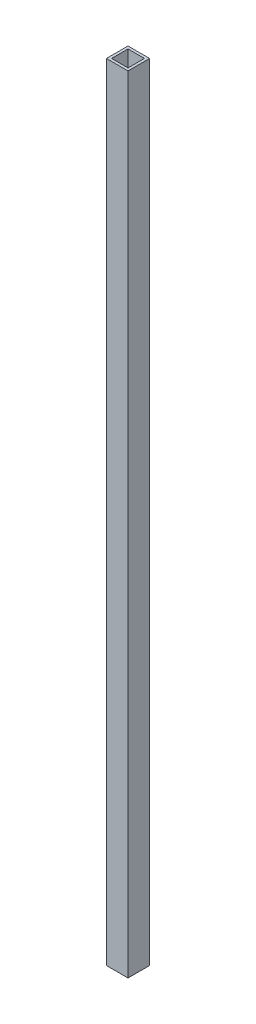
ISO-10303-21;
HEADER;
FILE_DESCRIPTION(('STEP AP214'),'2;1');
FILE_NAME('part.step','',(''),(''),'','','');
FILE_SCHEMA(('AUTOMOTIVE_DESIGN { 1 0 10303 214 1 1 1 1 }'));
ENDSEC;
DATA;
#1=APPLICATION_CONTEXT('core data for automotive mechanical design processes');
#2=APPLICATION_PROTOCOL_DEFINITION('international standard','automotive_design',2000,#1);
#3=PRODUCT_CONTEXT('',#1,'mechanical');
#4=PRODUCT('Part','Part','',(#3));
#5=PRODUCT_RELATED_PRODUCT_CATEGORY('part','',(#4));
#6=PRODUCT_DEFINITION_FORMATION('','',#4);
#7=PRODUCT_DEFINITION_CONTEXT('part definition',#1,'design');
#8=PRODUCT_DEFINITION('design','',#6,#7);
#9=PRODUCT_DEFINITION_SHAPE('','',#8);
#10=(LENGTH_UNIT() NAMED_UNIT(*) SI_UNIT(.MILLI.,.METRE.));
#11=(NAMED_UNIT(*) PLANE_ANGLE_UNIT() SI_UNIT($,.RADIAN.));
#12=(NAMED_UNIT(*) SI_UNIT($,.STERADIAN.) SOLID_ANGLE_UNIT());
#13=UNCERTAINTY_MEASURE_WITH_UNIT(LENGTH_MEASURE(1.E-05),#10,'distance_accuracy_value','');
#14=(GEOMETRIC_REPRESENTATION_CONTEXT(3) GLOBAL_UNCERTAINTY_ASSIGNED_CONTEXT((#13)) GLOBAL_UNIT_ASSIGNED_CONTEXT((#10,
#11,#12)) REPRESENTATION_CONTEXT('',''));
#15=CARTESIAN_POINT('',(0.,0.,0.));
#16=DIRECTION('',(0.,0.,1.));
#17=DIRECTION('',(1.,0.,0.));
#18=AXIS2_PLACEMENT_3D('',#15,#16,#17);
#19=CARTESIAN_POINT('',(0.,310.,0.));
#20=DIRECTION('',(0.,-1.,0.));
#21=DIRECTION('',(0.,0.,-1.));
#22=AXIS2_PLACEMENT_3D('',#19,#20,#21);
#23=PLANE('',#22);
#24=DIRECTION('',(0.,0.,1.));
#25=VECTOR('',#24,1.);
#26=CARTESIAN_POINT('',(15.8767045454545,310.,-21.8352272727272));
#27=LINE('',#26,#25);
#28=CARTESIAN_POINT('',(15.8767045454545,310.,-30.3352272727272));
#29=VERTEX_POINT('',#28);
#30=CARTESIAN_POINT('',(15.8767045454545,310.,-21.8352272727272));
#31=VERTEX_POINT('',#30);
#32=EDGE_CURVE('E153',#29,#31,#27,.T.);
#33=ORIENTED_EDGE('',*,*,#32,.T.);
#34=DIRECTION('',(1.,0.,0.));
#35=VECTOR('',#34,1.);
#36=CARTESIAN_POINT('',(15.8767045454545,310.,-21.8352272727272));
#37=LINE('',#36,#35);
#38=CARTESIAN_POINT('',(24.3767045454545,310.,-21.8352272727272));
#39=VERTEX_POINT('',#38);
#40=EDGE_CURVE('E157',#31,#39,#37,.T.);
#41=ORIENTED_EDGE('',*,*,#40,.T.);
#42=DIRECTION('',(0.,0.,-1.));
#43=VECTOR('',#42,1.);
#44=CARTESIAN_POINT('',(24.3767045454545,310.,-21.8352272727272));
#45=LINE('',#44,#43);
#46=CARTESIAN_POINT('',(24.3767045454545,310.,-30.3352272727272));
#47=VERTEX_POINT('',#46);
#48=EDGE_CURVE('E161',#39,#47,#45,.T.);
#49=ORIENTED_EDGE('',*,*,#48,.T.);
#50=DIRECTION('',(-1.,0.,0.));
#51=VECTOR('',#50,1.);
#52=CARTESIAN_POINT('',(15.8767045454545,310.,-30.3352272727272));
#53=LINE('',#52,#51);
#54=EDGE_CURVE('E164',#47,#29,#53,.T.);
#55=ORIENTED_EDGE('',*,*,#54,.T.);
#56=EDGE_LOOP('',(#33,#41,#49,#55));
#57=FACE_BOUND('',#56,.T.);
#58=DIRECTION('',(0.,0.,1.));
#59=VECTOR('',#58,1.);
#60=CARTESIAN_POINT('',(16.8767045454545,310.,-29.3352272727272));
#61=LINE('',#60,#59);
#62=CARTESIAN_POINT('',(16.8767045454545,310.,-29.3352272727272));
#63=VERTEX_POINT('',#62);
#64=CARTESIAN_POINT('',(16.8767045454545,310.,-22.8352272727272));
#65=VERTEX_POINT('',#64);
#66=EDGE_CURVE('E105',#63,#65,#61,.T.);
#67=ORIENTED_EDGE('',*,*,#66,.F.);
#68=DIRECTION('',(-1.,0.,0.));
#69=VECTOR('',#68,1.);
#70=CARTESIAN_POINT('',(16.8767045454545,310.,-29.3352272727272));
#71=LINE('',#70,#69);
#72=CARTESIAN_POINT('',(23.3767045454545,310.,-29.3352272727272));
#73=VERTEX_POINT('',#72);
#74=EDGE_CURVE('E131',#73,#63,#71,.T.);
#75=ORIENTED_EDGE('',*,*,#74,.F.);
#76=DIRECTION('',(0.,0.,-1.));
#77=VECTOR('',#76,1.);
#78=CARTESIAN_POINT('',(23.3767045454545,310.,-29.3352272727272));
#79=LINE('',#78,#77);
#80=CARTESIAN_POINT('',(23.3767045454545,310.,-22.8352272727272));
#81=VERTEX_POINT('',#80);
#82=EDGE_CURVE('E127',#81,#73,#79,.T.);
#83=ORIENTED_EDGE('',*,*,#82,.F.);
#84=DIRECTION('',(1.,0.,0.));
#85=VECTOR('',#84,1.);
#86=CARTESIAN_POINT('',(16.8767045454545,310.,-22.8352272727272));
#87=LINE('',#86,#85);
#88=EDGE_CURVE('E114',#65,#81,#87,.T.);
#89=ORIENTED_EDGE('',*,*,#88,.F.);
#90=EDGE_LOOP('',(#67,#75,#83,#89));
#91=FACE_BOUND('',#90,.T.);
#92=ADVANCED_FACE('F39',(#57,#91),#23,.F.);
#93=CARTESIAN_POINT('',(0.,0.,0.));
#94=DIRECTION('',(0.,-1.,0.));
#95=DIRECTION('',(0.,0.,-1.));
#96=AXIS2_PLACEMENT_3D('',#93,#94,#95);
#97=PLANE('',#96);
#98=DIRECTION('',(0.,0.,1.));
#99=VECTOR('',#98,1.);
#100=CARTESIAN_POINT('',(15.8767045454545,0.,-21.8352272727272));
#101=LINE('',#100,#99);
#102=CARTESIAN_POINT('',(15.8767045454545,0.,-30.3352272727272));
#103=VERTEX_POINT('',#102);
#104=CARTESIAN_POINT('',(15.8767045454545,0.,-21.8352272727272));
#105=VERTEX_POINT('',#104);
#106=EDGE_CURVE('E123',#103,#105,#101,.T.);
#107=ORIENTED_EDGE('',*,*,#106,.F.);
#108=DIRECTION('',(-1.,0.,0.));
#109=VECTOR('',#108,1.);
#110=CARTESIAN_POINT('',(15.8767045454545,0.,-30.3352272727272));
#111=LINE('',#110,#109);
#112=CARTESIAN_POINT('',(24.3767045454545,0.,-30.3352272727272));
#113=VERTEX_POINT('',#112);
#114=EDGE_CURVE('E158',#113,#103,#111,.T.);
#115=ORIENTED_EDGE('',*,*,#114,.F.);
#116=DIRECTION('',(0.,0.,-1.));
#117=VECTOR('',#116,1.);
#118=CARTESIAN_POINT('',(24.3767045454545,0.,-21.8352272727272));
#119=LINE('',#118,#117);
#120=CARTESIAN_POINT('',(24.3767045454545,0.,-21.8352272727272));
#121=VERTEX_POINT('',#120);
#122=EDGE_CURVE('E174',#121,#113,#119,.T.);
#123=ORIENTED_EDGE('',*,*,#122,.F.);
#124=DIRECTION('',(1.,0.,0.));
#125=VECTOR('',#124,1.);
#126=CARTESIAN_POINT('',(15.8767045454545,0.,-21.8352272727272));
#127=LINE('',#126,#125);
#128=EDGE_CURVE('E171',#105,#121,#127,.T.);
#129=ORIENTED_EDGE('',*,*,#128,.F.);
#130=EDGE_LOOP('',(#107,#115,#123,#129));
#131=FACE_BOUND('',#130,.T.);
#132=DIRECTION('',(-1.,0.,0.));
#133=VECTOR('',#132,1.);
#134=CARTESIAN_POINT('',(16.8767045454545,0.,-29.3352272727272));
#135=LINE('',#134,#133);
#136=CARTESIAN_POINT('',(23.3767045454545,0.,-29.3352272727272));
#137=VERTEX_POINT('',#136);
#138=CARTESIAN_POINT('',(16.8767045454545,0.,-29.3352272727272));
#139=VERTEX_POINT('',#138);
#140=EDGE_CURVE('E115',#137,#139,#135,.T.);
#141=ORIENTED_EDGE('',*,*,#140,.T.);
#142=DIRECTION('',(0.,0.,1.));
#143=VECTOR('',#142,1.);
#144=CARTESIAN_POINT('',(16.8767045454545,0.,-29.3352272727272));
#145=LINE('',#144,#143);
#146=CARTESIAN_POINT('',(16.8767045454545,0.,-22.8352272727272));
#147=VERTEX_POINT('',#146);
#148=EDGE_CURVE('E63',#139,#147,#145,.T.);
#149=ORIENTED_EDGE('',*,*,#148,.T.);
#150=DIRECTION('',(1.,0.,0.));
#151=VECTOR('',#150,1.);
#152=CARTESIAN_POINT('',(16.8767045454545,0.,-22.8352272727272));
#153=LINE('',#152,#151);
#154=CARTESIAN_POINT('',(23.3767045454545,0.,-22.8352272727272));
#155=VERTEX_POINT('',#154);
#156=EDGE_CURVE('E121',#147,#155,#153,.T.);
#157=ORIENTED_EDGE('',*,*,#156,.T.);
#158=DIRECTION('',(0.,0.,-1.));
#159=VECTOR('',#158,1.);
#160=CARTESIAN_POINT('',(23.3767045454545,0.,-29.3352272727272));
#161=LINE('',#160,#159);
#162=EDGE_CURVE('E140',#155,#137,#161,.T.);
#163=ORIENTED_EDGE('',*,*,#162,.T.);
#164=EDGE_LOOP('',(#141,#149,#157,#163));
#165=FACE_BOUND('',#164,.T.);
#166=ADVANCED_FACE('F197',(#131,#165),#97,.T.);
#167=CARTESIAN_POINT('',(15.8767045454545,310.,-21.8352272727272));
#168=DIRECTION('',(1.,0.,0.));
#169=DIRECTION('',(0.,0.,-1.));
#170=AXIS2_PLACEMENT_3D('',#167,#168,#169);
#171=PLANE('',#170);
#172=ORIENTED_EDGE('',*,*,#106,.T.);
#173=DIRECTION('',(0.,-1.,0.));
#174=VECTOR('',#173,1.);
#175=CARTESIAN_POINT('',(15.8767045454545,310.,-21.8352272727272));
#176=LINE('',#175,#174);
#177=EDGE_CURVE('E11',#31,#105,#176,.T.);
#178=ORIENTED_EDGE('',*,*,#177,.F.);
#179=ORIENTED_EDGE('',*,*,#32,.F.);
#180=DIRECTION('',(0.,-1.,0.));
#181=VECTOR('',#180,1.);
#182=CARTESIAN_POINT('',(15.8767045454545,310.,-30.3352272727272));
#183=LINE('',#182,#181);
#184=EDGE_CURVE('E167',#29,#103,#183,.T.);
#185=ORIENTED_EDGE('',*,*,#184,.T.);
#186=EDGE_LOOP('',(#172,#178,#179,#185));
#187=FACE_BOUND('',#186,.T.);
#188=ADVANCED_FACE('F41',(#187),#171,.F.);
#189=CARTESIAN_POINT('',(15.8767045454545,310.,-21.8352272727272));
#190=DIRECTION('',(0.,0.,-1.));
#191=DIRECTION('',(-1.,0.,0.));
#192=AXIS2_PLACEMENT_3D('',#189,#190,#191);
#193=PLANE('',#192);
#194=ORIENTED_EDGE('',*,*,#128,.T.);
#195=DIRECTION('',(0.,-1.,0.));
#196=VECTOR('',#195,1.);
#197=CARTESIAN_POINT('',(24.3767045454545,310.,-21.8352272727272));
#198=LINE('',#197,#196);
#199=EDGE_CURVE('E48',#39,#121,#198,.T.);
#200=ORIENTED_EDGE('',*,*,#199,.F.);
#201=ORIENTED_EDGE('',*,*,#40,.F.);
#202=ORIENTED_EDGE('',*,*,#177,.T.);
#203=EDGE_LOOP('',(#194,#200,#201,#202));
#204=FACE_BOUND('',#203,.T.);
#205=ADVANCED_FACE('F207',(#204),#193,.F.);
#206=CARTESIAN_POINT('',(24.3767045454545,310.,-21.8352272727272));
#207=DIRECTION('',(-1.,0.,0.));
#208=DIRECTION('',(0.,0.,1.));
#209=AXIS2_PLACEMENT_3D('',#206,#207,#208);
#210=PLANE('',#209);
#211=ORIENTED_EDGE('',*,*,#122,.T.);
#212=DIRECTION('',(0.,-1.,0.));
#213=VECTOR('',#212,1.);
#214=CARTESIAN_POINT('',(24.3767045454545,310.,-30.3352272727272));
#215=LINE('',#214,#213);
#216=EDGE_CURVE('E182',#47,#113,#215,.T.);
#217=ORIENTED_EDGE('',*,*,#216,.F.);
#218=ORIENTED_EDGE('',*,*,#48,.F.);
#219=ORIENTED_EDGE('',*,*,#199,.T.);
#220=EDGE_LOOP('',(#211,#217,#218,#219));
#221=FACE_BOUND('',#220,.T.);
#222=ADVANCED_FACE('F191',(#221),#210,.F.);
#223=CARTESIAN_POINT('',(15.8767045454545,310.,-30.3352272727272));
#224=DIRECTION('',(0.,0.,1.));
#225=DIRECTION('',(1.,0.,0.));
#226=AXIS2_PLACEMENT_3D('',#223,#224,#225);
#227=PLANE('',#226);
#228=ORIENTED_EDGE('',*,*,#114,.T.);
#229=ORIENTED_EDGE('',*,*,#184,.F.);
#230=ORIENTED_EDGE('',*,*,#54,.F.);
#231=ORIENTED_EDGE('',*,*,#216,.T.);
#232=EDGE_LOOP('',(#228,#229,#230,#231));
#233=FACE_BOUND('',#232,.T.);
#234=ADVANCED_FACE('F201',(#233),#227,.F.);
#235=CARTESIAN_POINT('',(16.8767045454545,310.,-29.3352272727272));
#236=DIRECTION('',(1.,0.,0.));
#237=DIRECTION('',(0.,0.,-1.));
#238=AXIS2_PLACEMENT_3D('',#235,#236,#237);
#239=PLANE('',#238);
#240=ORIENTED_EDGE('',*,*,#148,.F.);
#241=DIRECTION('',(0.,-1.,0.));
#242=VECTOR('',#241,1.);
#243=CARTESIAN_POINT('',(16.8767045454545,310.,-29.3352272727272));
#244=LINE('',#243,#242);
#245=EDGE_CURVE('E109',#63,#139,#244,.T.);
#246=ORIENTED_EDGE('',*,*,#245,.F.);
#247=ORIENTED_EDGE('',*,*,#66,.T.);
#248=DIRECTION('',(0.,-1.,0.));
#249=VECTOR('',#248,1.);
#250=CARTESIAN_POINT('',(16.8767045454545,310.,-22.8352272727272));
#251=LINE('',#250,#249);
#252=EDGE_CURVE('E108',#65,#147,#251,.T.);
#253=ORIENTED_EDGE('',*,*,#252,.T.);
#254=EDGE_LOOP('',(#240,#246,#247,#253));
#255=FACE_BOUND('',#254,.T.);
#256=ADVANCED_FACE('F107',(#255),#239,.T.);
#257=CARTESIAN_POINT('',(16.8767045454545,310.,-22.8352272727272));
#258=DIRECTION('',(0.,0.,-1.));
#259=DIRECTION('',(-1.,0.,0.));
#260=AXIS2_PLACEMENT_3D('',#257,#258,#259);
#261=PLANE('',#260);
#262=ORIENTED_EDGE('',*,*,#156,.F.);
#263=ORIENTED_EDGE('',*,*,#252,.F.);
#264=ORIENTED_EDGE('',*,*,#88,.T.);
#265=DIRECTION('',(0.,-1.,0.));
#266=VECTOR('',#265,1.);
#267=CARTESIAN_POINT('',(23.3767045454545,310.,-22.8352272727272));
#268=LINE('',#267,#266);
#269=EDGE_CURVE('E124',#81,#155,#268,.T.);
#270=ORIENTED_EDGE('',*,*,#269,.T.);
#271=EDGE_LOOP('',(#262,#263,#264,#270));
#272=FACE_BOUND('',#271,.T.);
#273=ADVANCED_FACE('F118',(#272),#261,.T.);
#274=CARTESIAN_POINT('',(23.3767045454545,310.,-29.3352272727272));
#275=DIRECTION('',(-1.,0.,0.));
#276=DIRECTION('',(0.,0.,1.));
#277=AXIS2_PLACEMENT_3D('',#274,#275,#276);
#278=PLANE('',#277);
#279=ORIENTED_EDGE('',*,*,#162,.F.);
#280=ORIENTED_EDGE('',*,*,#269,.F.);
#281=ORIENTED_EDGE('',*,*,#82,.T.);
#282=DIRECTION('',(0.,-1.,0.));
#283=VECTOR('',#282,1.);
#284=CARTESIAN_POINT('',(23.3767045454545,310.,-29.3352272727272));
#285=LINE('',#284,#283);
#286=EDGE_CURVE('E55',#73,#137,#285,.T.);
#287=ORIENTED_EDGE('',*,*,#286,.T.);
#288=EDGE_LOOP('',(#279,#280,#281,#287));
#289=FACE_BOUND('',#288,.T.);
#290=ADVANCED_FACE('F230',(#289),#278,.T.);
#291=CARTESIAN_POINT('',(16.8767045454545,310.,-29.3352272727272));
#292=DIRECTION('',(0.,0.,1.));
#293=DIRECTION('',(1.,0.,0.));
#294=AXIS2_PLACEMENT_3D('',#291,#292,#293);
#295=PLANE('',#294);
#296=ORIENTED_EDGE('',*,*,#140,.F.);
#297=ORIENTED_EDGE('',*,*,#286,.F.);
#298=ORIENTED_EDGE('',*,*,#74,.T.);
#299=ORIENTED_EDGE('',*,*,#245,.T.);
#300=EDGE_LOOP('',(#296,#297,#298,#299));
#301=FACE_BOUND('',#300,.T.);
#302=ADVANCED_FACE('F234',(#301),#295,.T.);
#303=CLOSED_SHELL('',(#92,#166,#188,#205,#222,#234,#256,#273,#290,#302));
#304=MANIFOLD_SOLID_BREP('B2',#303);
#305=ADVANCED_BREP_SHAPE_REPRESENTATION('',(#18,#304),#14);
#306=SHAPE_DEFINITION_REPRESENTATION(#9,#305);
ENDSEC;
END-ISO-10303-21;
